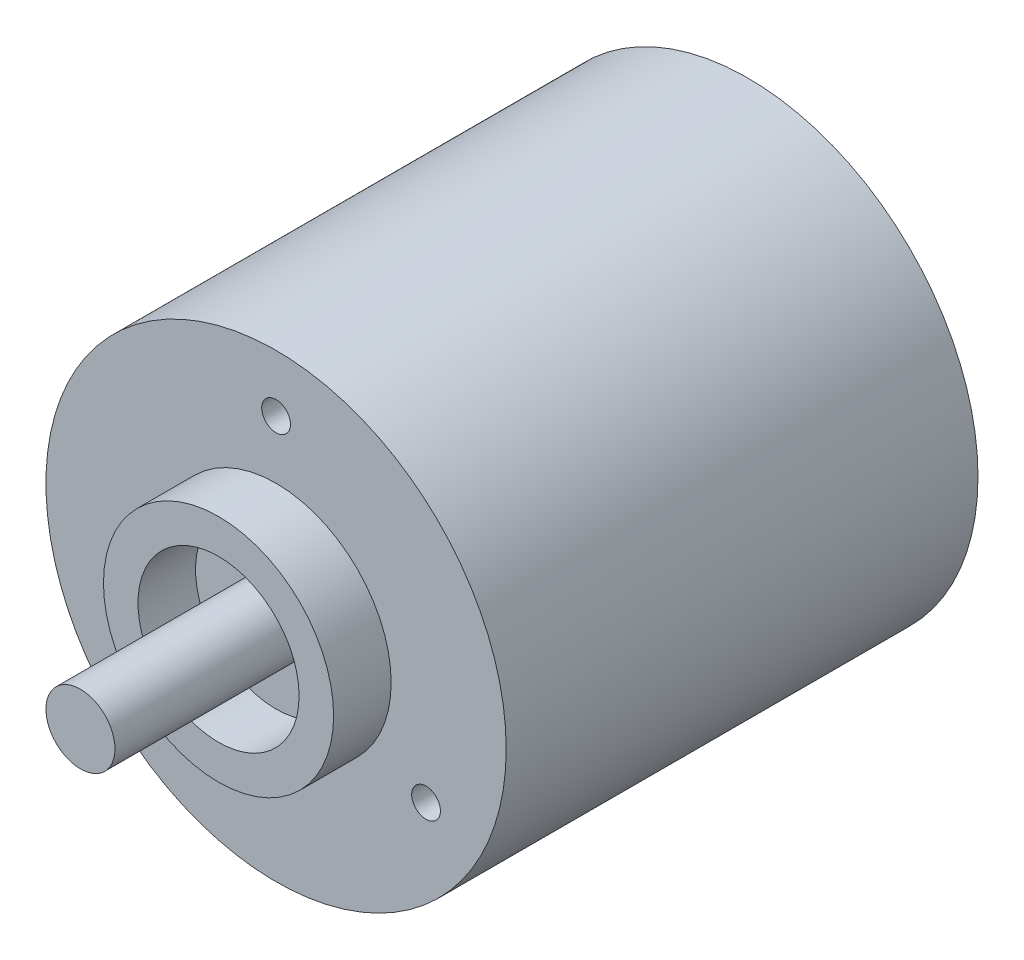
ISO-10303-21;
HEADER;
FILE_DESCRIPTION(('STEP AP214'),'2;1');
FILE_NAME('part.step','',(''),(''),'','','');
FILE_SCHEMA(('AUTOMOTIVE_DESIGN { 1 0 10303 214 1 1 1 1 }'));
ENDSEC;
DATA;
#1=APPLICATION_CONTEXT('core data for automotive mechanical design processes');
#2=APPLICATION_PROTOCOL_DEFINITION('international standard','automotive_design',2000,#1);
#3=PRODUCT_CONTEXT('',#1,'mechanical');
#4=PRODUCT('Part','Part','',(#3));
#5=PRODUCT_RELATED_PRODUCT_CATEGORY('part','',(#4));
#6=PRODUCT_DEFINITION_FORMATION('','',#4);
#7=PRODUCT_DEFINITION_CONTEXT('part definition',#1,'design');
#8=PRODUCT_DEFINITION('design','',#6,#7);
#9=PRODUCT_DEFINITION_SHAPE('','',#8);
#10=(LENGTH_UNIT() NAMED_UNIT(*) SI_UNIT(.MILLI.,.METRE.));
#11=(NAMED_UNIT(*) PLANE_ANGLE_UNIT() SI_UNIT($,.RADIAN.));
#12=(NAMED_UNIT(*) SI_UNIT($,.STERADIAN.) SOLID_ANGLE_UNIT());
#13=UNCERTAINTY_MEASURE_WITH_UNIT(LENGTH_MEASURE(1.E-05),#10,'distance_accuracy_value','');
#14=(GEOMETRIC_REPRESENTATION_CONTEXT(3) GLOBAL_UNCERTAINTY_ASSIGNED_CONTEXT((#13)) GLOBAL_UNIT_ASSIGNED_CONTEXT((#10,
#11,#12)) REPRESENTATION_CONTEXT('',''));
#15=CARTESIAN_POINT('',(0.,0.,0.));
#16=DIRECTION('',(0.,0.,1.));
#17=DIRECTION('',(1.,0.,0.));
#18=AXIS2_PLACEMENT_3D('',#15,#16,#17);
#19=CARTESIAN_POINT('',(0.,0.,-41.));
#20=DIRECTION('',(0.,0.,1.));
#21=DIRECTION('',(1.,0.,0.));
#22=AXIS2_PLACEMENT_3D('',#19,#20,#21);
#23=CYLINDRICAL_SURFACE('',#22,20.);
#24=CARTESIAN_POINT('',(0.,0.,-41.));
#25=DIRECTION('',(0.,0.,1.));
#26=DIRECTION('',(1.,0.,0.));
#27=AXIS2_PLACEMENT_3D('',#24,#25,#26);
#28=CIRCLE('',#27,20.);
#29=CARTESIAN_POINT('',(20.,0.,-41.));
#30=VERTEX_POINT('',#29);
#31=EDGE_CURVE('E39',#30,#30,#28,.T.);
#32=ORIENTED_EDGE('',*,*,#31,.T.);
#33=EDGE_LOOP('',(#32));
#34=FACE_BOUND('',#33,.T.);
#35=CARTESIAN_POINT('',(0.,0.,0.));
#36=DIRECTION('',(0.,0.,1.));
#37=DIRECTION('',(1.,0.,0.));
#38=AXIS2_PLACEMENT_3D('',#35,#36,#37);
#39=CIRCLE('',#38,20.);
#40=CARTESIAN_POINT('',(20.,0.,0.));
#41=VERTEX_POINT('',#40);
#42=EDGE_CURVE('E43',#41,#41,#39,.T.);
#43=ORIENTED_EDGE('',*,*,#42,.F.);
#44=EDGE_LOOP('',(#43));
#45=FACE_BOUND('',#44,.T.);
#46=ADVANCED_FACE('F33',(#34,#45),#23,.T.);
#47=CARTESIAN_POINT('',(0.,0.,-41.));
#48=DIRECTION('',(0.,0.,1.));
#49=DIRECTION('',(1.,0.,0.));
#50=AXIS2_PLACEMENT_3D('',#47,#48,#49);
#51=PLANE('',#50);
#52=ORIENTED_EDGE('',*,*,#31,.F.);
#53=EDGE_LOOP('',(#52));
#54=FACE_BOUND('',#53,.T.);
#55=ADVANCED_FACE('F96',(#54),#51,.F.);
#56=CARTESIAN_POINT('',(0.,0.,0.));
#57=DIRECTION('',(0.,0.,1.));
#58=DIRECTION('',(1.,0.,0.));
#59=AXIS2_PLACEMENT_3D('',#56,#57,#58);
#60=PLANE('',#59);
#61=CARTESIAN_POINT('',(-13.0336823269548,-7.52500000000056,0.));
#62=DIRECTION('',(0.,0.,1.));
#63=DIRECTION('',(1.,0.,0.));
#64=AXIS2_PLACEMENT_3D('',#61,#62,#63);
#65=CIRCLE('',#64,1.25000000000122);
#66=CARTESIAN_POINT('',(-11.7836823269536,-7.52500000000056,0.));
#67=VERTEX_POINT('',#66);
#68=EDGE_CURVE('E77',#67,#67,#65,.T.);
#69=ORIENTED_EDGE('',*,*,#68,.F.);
#70=EDGE_LOOP('',(#69));
#71=FACE_BOUND('',#70,.T.);
#72=CARTESIAN_POINT('',(13.0336823269568,-7.52499999999944,0.));
#73=DIRECTION('',(0.,0.,1.));
#74=DIRECTION('',(1.,0.,0.));
#75=AXIS2_PLACEMENT_3D('',#72,#73,#74);
#76=CIRCLE('',#75,1.25000000000083);
#77=CARTESIAN_POINT('',(14.2836823269576,-7.52499999999944,0.));
#78=VERTEX_POINT('',#77);
#79=EDGE_CURVE('E71',#78,#78,#76,.T.);
#80=ORIENTED_EDGE('',*,*,#79,.F.);
#81=EDGE_LOOP('',(#80));
#82=FACE_BOUND('',#81,.T.);
#83=CARTESIAN_POINT('',(0.,15.05,0.));
#84=DIRECTION('',(0.,0.,1.));
#85=DIRECTION('',(1.,0.,0.));
#86=AXIS2_PLACEMENT_3D('',#83,#84,#85);
#87=CIRCLE('',#86,1.25);
#88=CARTESIAN_POINT('',(1.25,15.05,0.));
#89=VERTEX_POINT('',#88);
#90=EDGE_CURVE('E65',#89,#89,#87,.T.);
#91=ORIENTED_EDGE('',*,*,#90,.F.);
#92=EDGE_LOOP('',(#91));
#93=FACE_BOUND('',#92,.T.);
#94=CARTESIAN_POINT('',(0.,0.,0.));
#95=DIRECTION('',(0.,0.,1.));
#96=DIRECTION('',(1.,0.,0.));
#97=AXIS2_PLACEMENT_3D('',#94,#95,#96);
#98=CIRCLE('',#97,10.);
#99=CARTESIAN_POINT('',(10.,0.,0.));
#100=VERTEX_POINT('',#99);
#101=EDGE_CURVE('E50',#100,#100,#98,.T.);
#102=ORIENTED_EDGE('',*,*,#101,.F.);
#103=EDGE_LOOP('',(#102));
#104=FACE_BOUND('',#103,.T.);
#105=ORIENTED_EDGE('',*,*,#42,.T.);
#106=EDGE_LOOP('',(#105));
#107=FACE_BOUND('',#106,.T.);
#108=ADVANCED_FACE('F92',(#71,#82,#93,#104,#107),#60,.T.);
#109=CARTESIAN_POINT('',(0.,0.,5.));
#110=DIRECTION('',(0.,0.,1.));
#111=DIRECTION('',(1.,0.,0.));
#112=AXIS2_PLACEMENT_3D('',#109,#110,#111);
#113=PLANE('',#112);
#114=CARTESIAN_POINT('',(0.,0.,5.));
#115=DIRECTION('',(0.,0.,1.));
#116=DIRECTION('',(1.,0.,0.));
#117=AXIS2_PLACEMENT_3D('',#114,#115,#116);
#118=CIRCLE('',#117,10.);
#119=CARTESIAN_POINT('',(10.,0.,5.));
#120=VERTEX_POINT('',#119);
#121=EDGE_CURVE('E48',#120,#120,#118,.T.);
#122=ORIENTED_EDGE('',*,*,#121,.T.);
#123=EDGE_LOOP('',(#122));
#124=FACE_BOUND('',#123,.T.);
#125=CARTESIAN_POINT('',(0.,0.,5.));
#126=DIRECTION('',(0.,0.,1.));
#127=DIRECTION('',(1.,0.,0.));
#128=AXIS2_PLACEMENT_3D('',#125,#126,#127);
#129=CIRCLE('',#128,7.);
#130=CARTESIAN_POINT('',(7.,0.,5.));
#131=VERTEX_POINT('',#130);
#132=EDGE_CURVE('E53',#131,#131,#129,.T.);
#133=ORIENTED_EDGE('',*,*,#132,.F.);
#134=EDGE_LOOP('',(#133));
#135=FACE_BOUND('',#134,.T.);
#136=ADVANCED_FACE('F95',(#124,#135),#113,.T.);
#137=CARTESIAN_POINT('',(0.,0.,5.));
#138=DIRECTION('',(0.,0.,-1.));
#139=DIRECTION('',(-1.,0.,0.));
#140=AXIS2_PLACEMENT_3D('',#137,#138,#139);
#141=CYLINDRICAL_SURFACE('',#140,10.);
#142=ORIENTED_EDGE('',*,*,#121,.F.);
#143=EDGE_LOOP('',(#142));
#144=FACE_BOUND('',#143,.T.);
#145=ORIENTED_EDGE('',*,*,#101,.T.);
#146=EDGE_LOOP('',(#145));
#147=FACE_BOUND('',#146,.T.);
#148=ADVANCED_FACE('F115',(#144,#147),#141,.T.);
#149=CARTESIAN_POINT('',(0.,0.,5.));
#150=DIRECTION('',(0.,0.,-1.));
#151=DIRECTION('',(-1.,0.,0.));
#152=AXIS2_PLACEMENT_3D('',#149,#150,#151);
#153=CYLINDRICAL_SURFACE('',#152,7.);
#154=ORIENTED_EDGE('',*,*,#132,.T.);
#155=EDGE_LOOP('',(#154));
#156=FACE_BOUND('',#155,.T.);
#157=CARTESIAN_POINT('',(0.,0.,0.));
#158=DIRECTION('',(0.,0.,1.));
#159=DIRECTION('',(1.,0.,0.));
#160=AXIS2_PLACEMENT_3D('',#157,#158,#159);
#161=CIRCLE('',#160,7.);
#162=CARTESIAN_POINT('',(7.,0.,0.));
#163=VERTEX_POINT('',#162);
#164=EDGE_CURVE('E10',#163,#163,#161,.F.);
#165=ORIENTED_EDGE('',*,*,#164,.T.);
#166=EDGE_LOOP('',(#165));
#167=FACE_BOUND('',#166,.T.);
#168=ADVANCED_FACE('F118',(#156,#167),#153,.F.);
#169=CARTESIAN_POINT('',(0.,0.,0.));
#170=DIRECTION('',(0.,0.,1.));
#171=DIRECTION('',(1.,0.,0.));
#172=AXIS2_PLACEMENT_3D('',#169,#170,#171);
#173=CIRCLE('',#172,3.);
#174=CARTESIAN_POINT('',(3.,0.,0.));
#175=VERTEX_POINT('',#174);
#176=EDGE_CURVE('E59',#175,#175,#173,.T.);
#177=ORIENTED_EDGE('',*,*,#176,.F.);
#178=EDGE_LOOP('',(#177));
#179=FACE_BOUND('',#178,.T.);
#180=ORIENTED_EDGE('',*,*,#164,.F.);
#181=EDGE_LOOP('',(#180));
#182=FACE_BOUND('',#181,.T.);
#183=ADVANCED_FACE('F97',(#179,#182),#60,.T.);
#184=CARTESIAN_POINT('',(0.,0.,17.));
#185=DIRECTION('',(0.,0.,-1.));
#186=DIRECTION('',(-1.,0.,0.));
#187=AXIS2_PLACEMENT_3D('',#184,#185,#186);
#188=CYLINDRICAL_SURFACE('',#187,3.);
#189=CARTESIAN_POINT('',(0.,0.,17.));
#190=DIRECTION('',(0.,0.,1.));
#191=DIRECTION('',(1.,0.,0.));
#192=AXIS2_PLACEMENT_3D('',#189,#190,#191);
#193=CIRCLE('',#192,3.);
#194=CARTESIAN_POINT('',(3.,0.,17.));
#195=VERTEX_POINT('',#194);
#196=EDGE_CURVE('E58',#195,#195,#193,.T.);
#197=ORIENTED_EDGE('',*,*,#196,.F.);
#198=EDGE_LOOP('',(#197));
#199=FACE_BOUND('',#198,.T.);
#200=ORIENTED_EDGE('',*,*,#176,.T.);
#201=EDGE_LOOP('',(#200));
#202=FACE_BOUND('',#201,.T.);
#203=ADVANCED_FACE('F126',(#199,#202),#188,.T.);
#204=CARTESIAN_POINT('',(0.,0.,17.));
#205=DIRECTION('',(0.,0.,1.));
#206=DIRECTION('',(1.,0.,0.));
#207=AXIS2_PLACEMENT_3D('',#204,#205,#206);
#208=PLANE('',#207);
#209=ORIENTED_EDGE('',*,*,#196,.T.);
#210=EDGE_LOOP('',(#209));
#211=FACE_BOUND('',#210,.T.);
#212=ADVANCED_FACE('F129',(#211),#208,.T.);
#213=CARTESIAN_POINT('',(0.,15.05,-7.9));
#214=DIRECTION('',(0.,0.,1.));
#215=DIRECTION('',(1.,0.,0.));
#216=AXIS2_PLACEMENT_3D('',#213,#214,#215);
#217=CYLINDRICAL_SURFACE('',#216,1.25);
#218=CARTESIAN_POINT('',(0.,15.05,-7.9));
#219=DIRECTION('',(0.,0.,1.));
#220=DIRECTION('',(1.,0.,0.));
#221=AXIS2_PLACEMENT_3D('',#218,#219,#220);
#222=CIRCLE('',#221,1.25);
#223=CARTESIAN_POINT('',(1.25,15.05,-7.9));
#224=VERTEX_POINT('',#223);
#225=EDGE_CURVE('E62',#224,#224,#222,.T.);
#226=ORIENTED_EDGE('',*,*,#225,.F.);
#227=EDGE_LOOP('',(#226));
#228=FACE_BOUND('',#227,.T.);
#229=ORIENTED_EDGE('',*,*,#90,.T.);
#230=EDGE_LOOP('',(#229));
#231=FACE_BOUND('',#230,.T.);
#232=ADVANCED_FACE('F133',(#228,#231),#217,.F.);
#233=CARTESIAN_POINT('',(0.,15.05,-7.9));
#234=DIRECTION('',(0.,0.,1.));
#235=DIRECTION('',(1.,0.,0.));
#236=AXIS2_PLACEMENT_3D('',#233,#234,#235);
#237=PLANE('',#236);
#238=ORIENTED_EDGE('',*,*,#225,.T.);
#239=EDGE_LOOP('',(#238));
#240=FACE_BOUND('',#239,.T.);
#241=ADVANCED_FACE('F137',(#240),#237,.T.);
#242=CARTESIAN_POINT('',(13.0336823269568,-7.52499999999944,-7.9));
#243=DIRECTION('',(0.,0.,1.));
#244=DIRECTION('',(1.,0.,0.));
#245=AXIS2_PLACEMENT_3D('',#242,#243,#244);
#246=CYLINDRICAL_SURFACE('',#245,1.25000000000083);
#247=CARTESIAN_POINT('',(13.0336823269568,-7.52499999999944,-7.9));
#248=DIRECTION('',(0.,0.,1.));
#249=DIRECTION('',(1.,0.,0.));
#250=AXIS2_PLACEMENT_3D('',#247,#248,#249);
#251=CIRCLE('',#250,1.25000000000083);
#252=CARTESIAN_POINT('',(14.2836823269576,-7.52499999999944,-7.9));
#253=VERTEX_POINT('',#252);
#254=EDGE_CURVE('E68',#253,#253,#251,.T.);
#255=ORIENTED_EDGE('',*,*,#254,.F.);
#256=EDGE_LOOP('',(#255));
#257=FACE_BOUND('',#256,.T.);
#258=ORIENTED_EDGE('',*,*,#79,.T.);
#259=EDGE_LOOP('',(#258));
#260=FACE_BOUND('',#259,.T.);
#261=ADVANCED_FACE('F141',(#257,#260),#246,.F.);
#262=CARTESIAN_POINT('',(13.0336823269568,-7.52499999999944,-7.9));
#263=DIRECTION('',(0.,0.,1.));
#264=DIRECTION('',(1.,0.,0.));
#265=AXIS2_PLACEMENT_3D('',#262,#263,#264);
#266=PLANE('',#265);
#267=ORIENTED_EDGE('',*,*,#254,.T.);
#268=EDGE_LOOP('',(#267));
#269=FACE_BOUND('',#268,.T.);
#270=ADVANCED_FACE('F88',(#269),#266,.T.);
#271=CARTESIAN_POINT('',(-13.0336823269548,-7.52500000000056,-7.9));
#272=DIRECTION('',(0.,0.,1.));
#273=DIRECTION('',(1.,0.,0.));
#274=AXIS2_PLACEMENT_3D('',#271,#272,#273);
#275=CYLINDRICAL_SURFACE('',#274,1.25000000000122);
#276=CARTESIAN_POINT('',(-13.0336823269548,-7.52500000000056,-7.9));
#277=DIRECTION('',(0.,0.,1.));
#278=DIRECTION('',(1.,0.,0.));
#279=AXIS2_PLACEMENT_3D('',#276,#277,#278);
#280=CIRCLE('',#279,1.25000000000122);
#281=CARTESIAN_POINT('',(-11.7836823269536,-7.52500000000056,-7.9));
#282=VERTEX_POINT('',#281);
#283=EDGE_CURVE('E74',#282,#282,#280,.T.);
#284=ORIENTED_EDGE('',*,*,#283,.F.);
#285=EDGE_LOOP('',(#284));
#286=FACE_BOUND('',#285,.T.);
#287=ORIENTED_EDGE('',*,*,#68,.T.);
#288=EDGE_LOOP('',(#287));
#289=FACE_BOUND('',#288,.T.);
#290=ADVANCED_FACE('F85',(#286,#289),#275,.F.);
#291=CARTESIAN_POINT('',(-13.0336823269548,-7.52500000000056,-7.9));
#292=DIRECTION('',(0.,0.,1.));
#293=DIRECTION('',(1.,0.,0.));
#294=AXIS2_PLACEMENT_3D('',#291,#292,#293);
#295=PLANE('',#294);
#296=ORIENTED_EDGE('',*,*,#283,.T.);
#297=EDGE_LOOP('',(#296));
#298=FACE_BOUND('',#297,.T.);
#299=ADVANCED_FACE('F83',(#298),#295,.T.);
#300=CLOSED_SHELL('',(#46,#55,#108,#136,#148,#168,#183,#203,#212,#232,#241,#261,#270,#290,#299));
#301=MANIFOLD_SOLID_BREP('B2',#300);
#302=ADVANCED_BREP_SHAPE_REPRESENTATION('',(#18,#301),#14);
#303=SHAPE_DEFINITION_REPRESENTATION(#9,#302);
ENDSEC;
END-ISO-10303-21;
